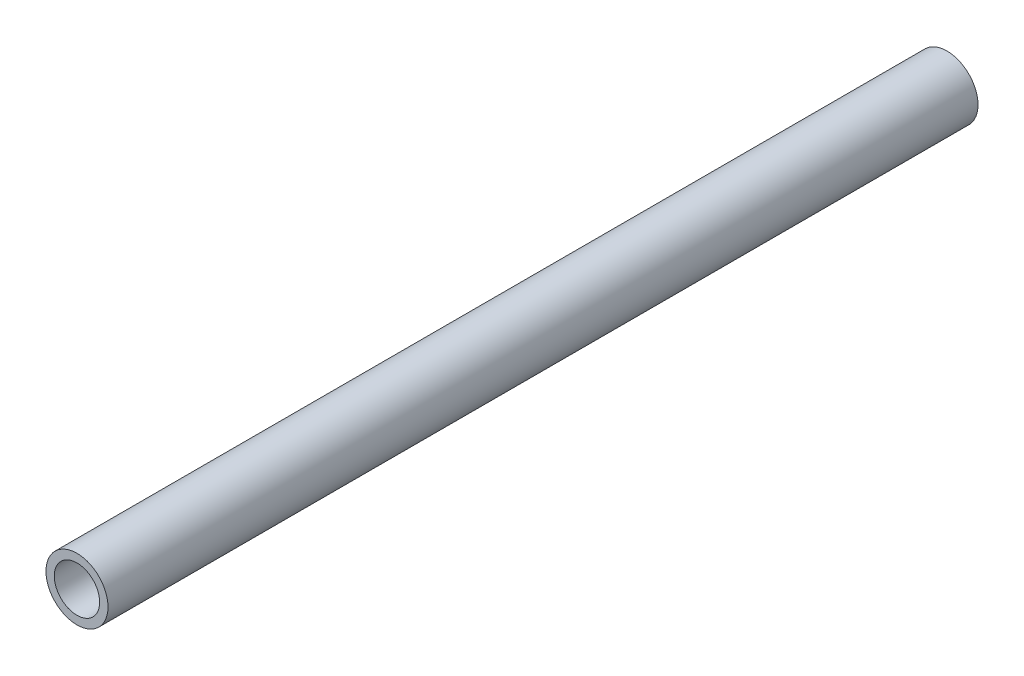
ISO-10303-21;
HEADER;
FILE_DESCRIPTION(('STEP AP214'),'2;1');
FILE_NAME('part.step','',(''),(''),'','','');
FILE_SCHEMA(('AUTOMOTIVE_DESIGN { 1 0 10303 214 1 1 1 1 }'));
ENDSEC;
DATA;
#1=APPLICATION_CONTEXT('core data for automotive mechanical design processes');
#2=APPLICATION_PROTOCOL_DEFINITION('international standard','automotive_design',2000,#1);
#3=PRODUCT_CONTEXT('',#1,'mechanical');
#4=PRODUCT('Part','Part','',(#3));
#5=PRODUCT_RELATED_PRODUCT_CATEGORY('part','',(#4));
#6=PRODUCT_DEFINITION_FORMATION('','',#4);
#7=PRODUCT_DEFINITION_CONTEXT('part definition',#1,'design');
#8=PRODUCT_DEFINITION('design','',#6,#7);
#9=PRODUCT_DEFINITION_SHAPE('','',#8);
#10=(LENGTH_UNIT() NAMED_UNIT(*) SI_UNIT(.MILLI.,.METRE.));
#11=(NAMED_UNIT(*) PLANE_ANGLE_UNIT() SI_UNIT($,.RADIAN.));
#12=(NAMED_UNIT(*) SI_UNIT($,.STERADIAN.) SOLID_ANGLE_UNIT());
#13=UNCERTAINTY_MEASURE_WITH_UNIT(LENGTH_MEASURE(1.E-05),#10,'distance_accuracy_value','');
#14=(GEOMETRIC_REPRESENTATION_CONTEXT(3) GLOBAL_UNCERTAINTY_ASSIGNED_CONTEXT((#13)) GLOBAL_UNIT_ASSIGNED_CONTEXT((#10,
#11,#12)) REPRESENTATION_CONTEXT('',''));
#15=CARTESIAN_POINT('',(0.,0.,0.));
#16=DIRECTION('',(0.,0.,1.));
#17=DIRECTION('',(1.,0.,0.));
#18=AXIS2_PLACEMENT_3D('',#15,#16,#17);
#19=CARTESIAN_POINT('',(0.,0.,150.));
#20=DIRECTION('',(0.,0.,1.));
#21=DIRECTION('',(1.,0.,0.));
#22=AXIS2_PLACEMENT_3D('',#19,#20,#21);
#23=PLANE('',#22);
#24=CARTESIAN_POINT('',(0.,0.,150.));
#25=DIRECTION('',(0.,0.,1.));
#26=DIRECTION('',(1.,0.,0.));
#27=AXIS2_PLACEMENT_3D('',#24,#25,#26);
#28=CIRCLE('',#27,10.7);
#29=CARTESIAN_POINT('',(10.7,0.,150.));
#30=VERTEX_POINT('',#29);
#31=EDGE_CURVE('E10',#30,#30,#28,.T.);
#32=ORIENTED_EDGE('',*,*,#31,.T.);
#33=EDGE_LOOP('',(#32));
#34=FACE_BOUND('',#33,.T.);
#35=CARTESIAN_POINT('',(0.,0.,150.));
#36=DIRECTION('',(0.,0.,1.));
#37=DIRECTION('',(1.,0.,0.));
#38=AXIS2_PLACEMENT_3D('',#35,#36,#37);
#39=CIRCLE('',#38,7.825);
#40=CARTESIAN_POINT('',(7.825,0.,150.));
#41=VERTEX_POINT('',#40);
#42=EDGE_CURVE('E50',#41,#41,#39,.T.);
#43=ORIENTED_EDGE('',*,*,#42,.F.);
#44=EDGE_LOOP('',(#43));
#45=FACE_BOUND('',#44,.T.);
#46=ADVANCED_FACE('F37',(#34,#45),#23,.T.);
#47=CARTESIAN_POINT('',(0.,0.,-150.));
#48=DIRECTION('',(0.,0.,1.));
#49=DIRECTION('',(1.,0.,0.));
#50=AXIS2_PLACEMENT_3D('',#47,#48,#49);
#51=PLANE('',#50);
#52=CARTESIAN_POINT('',(0.,0.,-150.));
#53=DIRECTION('',(0.,0.,1.));
#54=DIRECTION('',(1.,0.,0.));
#55=AXIS2_PLACEMENT_3D('',#52,#53,#54);
#56=CIRCLE('',#55,10.7);
#57=CARTESIAN_POINT('',(10.7,0.,-150.));
#58=VERTEX_POINT('',#57);
#59=EDGE_CURVE('E41',#58,#58,#56,.T.);
#60=ORIENTED_EDGE('',*,*,#59,.F.);
#61=EDGE_LOOP('',(#60));
#62=FACE_BOUND('',#61,.T.);
#63=CARTESIAN_POINT('',(0.,0.,-150.));
#64=DIRECTION('',(0.,0.,1.));
#65=DIRECTION('',(1.,0.,0.));
#66=AXIS2_PLACEMENT_3D('',#63,#64,#65);
#67=CIRCLE('',#66,7.825);
#68=CARTESIAN_POINT('',(7.825,0.,-150.));
#69=VERTEX_POINT('',#68);
#70=EDGE_CURVE('E52',#69,#69,#67,.T.);
#71=ORIENTED_EDGE('',*,*,#70,.T.);
#72=EDGE_LOOP('',(#71));
#73=FACE_BOUND('',#72,.T.);
#74=ADVANCED_FACE('F64',(#62,#73),#51,.F.);
#75=CARTESIAN_POINT('',(0.,0.,150.));
#76=DIRECTION('',(0.,0.,-1.));
#77=DIRECTION('',(-1.,0.,0.));
#78=AXIS2_PLACEMENT_3D('',#75,#76,#77);
#79=CYLINDRICAL_SURFACE('',#78,10.7);
#80=ORIENTED_EDGE('',*,*,#31,.F.);
#81=EDGE_LOOP('',(#80));
#82=FACE_BOUND('',#81,.T.);
#83=ORIENTED_EDGE('',*,*,#59,.T.);
#84=EDGE_LOOP('',(#83));
#85=FACE_BOUND('',#84,.T.);
#86=ADVANCED_FACE('F39',(#82,#85),#79,.T.);
#87=CARTESIAN_POINT('',(0.,0.,150.));
#88=DIRECTION('',(0.,0.,-1.));
#89=DIRECTION('',(-1.,0.,0.));
#90=AXIS2_PLACEMENT_3D('',#87,#88,#89);
#91=CYLINDRICAL_SURFACE('',#90,7.825);
#92=ORIENTED_EDGE('',*,*,#42,.T.);
#93=EDGE_LOOP('',(#92));
#94=FACE_BOUND('',#93,.T.);
#95=ORIENTED_EDGE('',*,*,#70,.F.);
#96=EDGE_LOOP('',(#95));
#97=FACE_BOUND('',#96,.T.);
#98=ADVANCED_FACE('F60',(#94,#97),#91,.F.);
#99=CLOSED_SHELL('',(#46,#74,#86,#98));
#100=MANIFOLD_SOLID_BREP('B2',#99);
#101=ADVANCED_BREP_SHAPE_REPRESENTATION('',(#18,#100),#14);
#102=SHAPE_DEFINITION_REPRESENTATION(#9,#101);
ENDSEC;
END-ISO-10303-21;
